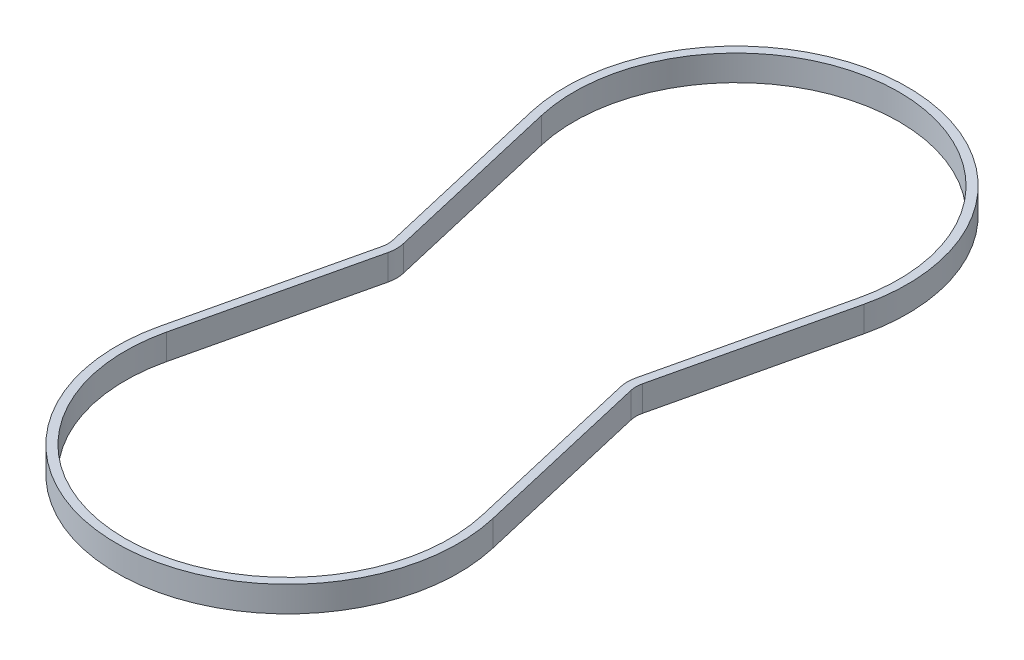
ISO-10303-21;
HEADER;
FILE_DESCRIPTION(('STEP AP214'),'2;1');
FILE_NAME('part.step','',(''),(''),'','','');
FILE_SCHEMA(('AUTOMOTIVE_DESIGN { 1 0 10303 214 1 1 1 1 }'));
ENDSEC;
DATA;
#1=APPLICATION_CONTEXT('core data for automotive mechanical design processes');
#2=APPLICATION_PROTOCOL_DEFINITION('international standard','automotive_design',2000,#1);
#3=PRODUCT_CONTEXT('',#1,'mechanical');
#4=PRODUCT('Part','Part','',(#3));
#5=PRODUCT_RELATED_PRODUCT_CATEGORY('part','',(#4));
#6=PRODUCT_DEFINITION_FORMATION('','',#4);
#7=PRODUCT_DEFINITION_CONTEXT('part definition',#1,'design');
#8=PRODUCT_DEFINITION('design','',#6,#7);
#9=PRODUCT_DEFINITION_SHAPE('','',#8);
#10=(LENGTH_UNIT() NAMED_UNIT(*) SI_UNIT(.MILLI.,.METRE.));
#11=(NAMED_UNIT(*) PLANE_ANGLE_UNIT() SI_UNIT($,.RADIAN.));
#12=(NAMED_UNIT(*) SI_UNIT($,.STERADIAN.) SOLID_ANGLE_UNIT());
#13=UNCERTAINTY_MEASURE_WITH_UNIT(LENGTH_MEASURE(1.E-05),#10,'distance_accuracy_value','');
#14=(GEOMETRIC_REPRESENTATION_CONTEXT(3) GLOBAL_UNCERTAINTY_ASSIGNED_CONTEXT((#13)) GLOBAL_UNIT_ASSIGNED_CONTEXT((#10,
#11,#12)) REPRESENTATION_CONTEXT('',''));
#15=CARTESIAN_POINT('',(0.,0.,0.));
#16=DIRECTION('',(0.,0.,1.));
#17=DIRECTION('',(1.,0.,0.));
#18=AXIS2_PLACEMENT_3D('',#15,#16,#17);
#19=CARTESIAN_POINT('',(0.,6.,-52.5));
#20=DIRECTION('',(0.,1.,0.));
#21=DIRECTION('',(0.,0.,1.));
#22=AXIS2_PLACEMENT_3D('',#19,#20,#21);
#23=PLANE('',#22);
#24=CARTESIAN_POINT('',(0.,6.,-52.5));
#25=DIRECTION('',(0.,1.,0.));
#26=DIRECTION('',(0.,0.,1.));
#27=AXIS2_PLACEMENT_3D('',#24,#25,#26);
#28=CIRCLE('',#27,40.);
#29=CARTESIAN_POINT('',(38.9565926048337,6.,-43.4234426889368));
#30=VERTEX_POINT('',#29);
#31=CARTESIAN_POINT('',(-38.9565926048337,6.,-43.4234426889368));
#32=VERTEX_POINT('',#31);
#33=EDGE_CURVE('E261',#30,#32,#28,.T.);
#34=ORIENTED_EDGE('',*,*,#33,.T.);
#35=DIRECTION('',(0.226913932776581,0.,0.973914815120843));
#36=VECTOR('',#35,1.);
#37=CARTESIAN_POINT('',(-38.9565926048337,6.,-43.4234426889368));
#38=LINE('',#37,#36);
#39=CARTESIAN_POINT('',(-29.1565111092749,6.,-1.36148359665949));
#40=VERTEX_POINT('',#39);
#41=EDGE_CURVE('E264',#32,#40,#38,.T.);
#42=ORIENTED_EDGE('',*,*,#41,.T.);
#43=CARTESIAN_POINT('',(-35.,6.,0.));
#44=DIRECTION('',(0.,-1.,0.));
#45=DIRECTION('',(0.,0.,1.));
#46=AXIS2_PLACEMENT_3D('',#43,#44,#45);
#47=CIRCLE('',#46,6.);
#48=CARTESIAN_POINT('',(-29.1565111092749,6.,1.36148359665949));
#49=VERTEX_POINT('',#48);
#50=EDGE_CURVE('E267',#40,#49,#47,.T.);
#51=ORIENTED_EDGE('',*,*,#50,.T.);
#52=DIRECTION('',(-0.226913932776581,0.,0.973914815120843));
#53=VECTOR('',#52,1.);
#54=CARTESIAN_POINT('',(-38.9565926048337,6.,43.4234426889368));
#55=LINE('',#54,#53);
#56=CARTESIAN_POINT('',(-38.9565926048337,6.,43.4234426889368));
#57=VERTEX_POINT('',#56);
#58=EDGE_CURVE('E269',#49,#57,#55,.T.);
#59=ORIENTED_EDGE('',*,*,#58,.T.);
#60=CARTESIAN_POINT('',(0.,6.,52.5));
#61=DIRECTION('',(0.,1.,0.));
#62=DIRECTION('',(0.,0.,1.));
#63=AXIS2_PLACEMENT_3D('',#60,#61,#62);
#64=CIRCLE('',#63,40.);
#65=CARTESIAN_POINT('',(38.9565926048337,6.,43.4234426889368));
#66=VERTEX_POINT('',#65);
#67=EDGE_CURVE('E271',#57,#66,#64,.T.);
#68=ORIENTED_EDGE('',*,*,#67,.T.);
#69=DIRECTION('',(-0.226913932776581,0.,-0.973914815120843));
#70=VECTOR('',#69,1.);
#71=CARTESIAN_POINT('',(29.1565111092749,6.,1.36148359665949));
#72=LINE('',#71,#70);
#73=CARTESIAN_POINT('',(29.1565111092749,6.,1.36148359665949));
#74=VERTEX_POINT('',#73);
#75=EDGE_CURVE('E273',#66,#74,#72,.T.);
#76=ORIENTED_EDGE('',*,*,#75,.T.);
#77=CARTESIAN_POINT('',(35.,6.,0.));
#78=DIRECTION('',(0.,-1.,0.));
#79=DIRECTION('',(0.,0.,1.));
#80=AXIS2_PLACEMENT_3D('',#77,#78,#79);
#81=CIRCLE('',#80,6.);
#82=CARTESIAN_POINT('',(29.1565111092749,6.,-1.36148359665948));
#83=VERTEX_POINT('',#82);
#84=EDGE_CURVE('E275',#74,#83,#81,.T.);
#85=ORIENTED_EDGE('',*,*,#84,.T.);
#86=DIRECTION('',(0.226913932776581,0.,-0.973914815120843));
#87=VECTOR('',#86,1.);
#88=CARTESIAN_POINT('',(38.9565926048337,6.,-43.4234426889368));
#89=LINE('',#88,#87);
#90=EDGE_CURVE('E277',#83,#30,#89,.T.);
#91=ORIENTED_EDGE('',*,*,#90,.T.);
#92=EDGE_LOOP('',(#34,#42,#51,#59,#68,#76,#85,#91));
#93=FACE_BOUND('',#92,.T.);
#94=DIRECTION('',(0.226913932776581,0.,0.973914815120843));
#95=VECTOR('',#94,1.);
#96=CARTESIAN_POINT('',(-37.008762974592,6.,-43.8772705544899));
#97=LINE('',#96,#95);
#98=CARTESIAN_POINT('',(-37.008762974592,6.,-43.8772705544899));
#99=VERTEX_POINT('',#98);
#100=CARTESIAN_POINT('',(-27.2086814790333,6.,-1.81531146221264));
#101=VERTEX_POINT('',#100);
#102=EDGE_CURVE('E204',#99,#101,#97,.T.);
#103=ORIENTED_EDGE('',*,*,#102,.F.);
#104=CARTESIAN_POINT('',(0.,6.,-52.5));
#105=DIRECTION('',(0.,1.,0.));
#106=DIRECTION('',(1.,0.,0.));
#107=AXIS2_PLACEMENT_3D('',#104,#105,#106);
#108=CIRCLE('',#107,38.);
#109=CARTESIAN_POINT('',(37.008762974592,6.,-43.8772705544899));
#110=VERTEX_POINT('',#109);
#111=EDGE_CURVE('E196',#110,#99,#108,.T.);
#112=ORIENTED_EDGE('',*,*,#111,.F.);
#113=DIRECTION('',(0.226913932776581,0.,-0.973914815120843));
#114=VECTOR('',#113,1.);
#115=CARTESIAN_POINT('',(37.008762974592,6.,-43.8772705544899));
#116=LINE('',#115,#114);
#117=CARTESIAN_POINT('',(27.2086814790333,6.,-1.81531146221265));
#118=VERTEX_POINT('',#117);
#119=EDGE_CURVE('E229',#118,#110,#116,.T.);
#120=ORIENTED_EDGE('',*,*,#119,.F.);
#121=CARTESIAN_POINT('',(35.,6.,0.));
#122=DIRECTION('',(0.,1.,0.));
#123=DIRECTION('',(1.,0.,0.));
#124=AXIS2_PLACEMENT_3D('',#121,#122,#123);
#125=CIRCLE('',#124,8.);
#126=CARTESIAN_POINT('',(27.2086814790333,6.,1.81531146221265));
#127=VERTEX_POINT('',#126);
#128=EDGE_CURVE('E227',#127,#118,#125,.F.);
#129=ORIENTED_EDGE('',*,*,#128,.F.);
#130=DIRECTION('',(-0.226913932776581,0.,-0.973914815120843));
#131=VECTOR('',#130,1.);
#132=CARTESIAN_POINT('',(27.2086814790333,6.,1.81531146221265));
#133=LINE('',#132,#131);
#134=CARTESIAN_POINT('',(37.008762974592,6.,43.8772705544899));
#135=VERTEX_POINT('',#134);
#136=EDGE_CURVE('E225',#135,#127,#133,.T.);
#137=ORIENTED_EDGE('',*,*,#136,.F.);
#138=CARTESIAN_POINT('',(0.,6.,52.5));
#139=DIRECTION('',(0.,1.,0.));
#140=DIRECTION('',(1.,0.,0.));
#141=AXIS2_PLACEMENT_3D('',#138,#139,#140);
#142=CIRCLE('',#141,38.);
#143=CARTESIAN_POINT('',(-37.008762974592,6.,43.8772705544899));
#144=VERTEX_POINT('',#143);
#145=EDGE_CURVE('E223',#144,#135,#142,.T.);
#146=ORIENTED_EDGE('',*,*,#145,.F.);
#147=DIRECTION('',(-0.226913932776581,0.,0.973914815120843));
#148=VECTOR('',#147,1.);
#149=CARTESIAN_POINT('',(-37.008762974592,6.,43.8772705544899));
#150=LINE('',#149,#148);
#151=CARTESIAN_POINT('',(-27.2086814790333,6.,1.81531146221265));
#152=VERTEX_POINT('',#151);
#153=EDGE_CURVE('E219',#152,#144,#150,.T.);
#154=ORIENTED_EDGE('',*,*,#153,.F.);
#155=CARTESIAN_POINT('',(-35.,6.,0.));
#156=DIRECTION('',(0.,1.,0.));
#157=DIRECTION('',(1.,0.,0.));
#158=AXIS2_PLACEMENT_3D('',#155,#156,#157);
#159=CIRCLE('',#158,8.);
#160=EDGE_CURVE('E217',#101,#152,#159,.F.);
#161=ORIENTED_EDGE('',*,*,#160,.F.);
#162=EDGE_LOOP('',(#103,#112,#120,#129,#137,#146,#154,#161));
#163=FACE_BOUND('',#162,.T.);
#164=ADVANCED_FACE('F83',(#93,#163),#23,.T.);
#165=CARTESIAN_POINT('',(0.,0.,-52.5));
#166=DIRECTION('',(0.,1.,0.));
#167=DIRECTION('',(0.,0.,1.));
#168=AXIS2_PLACEMENT_3D('',#165,#166,#167);
#169=PLANE('',#168);
#170=CARTESIAN_POINT('',(0.,0.,-52.5));
#171=DIRECTION('',(0.,1.,0.));
#172=DIRECTION('',(0.,0.,1.));
#173=AXIS2_PLACEMENT_3D('',#170,#171,#172);
#174=CIRCLE('',#173,40.);
#175=CARTESIAN_POINT('',(38.9565926048337,0.,-43.4234426889368));
#176=VERTEX_POINT('',#175);
#177=CARTESIAN_POINT('',(-38.9565926048337,0.,-43.4234426889368));
#178=VERTEX_POINT('',#177);
#179=EDGE_CURVE('E212',#176,#178,#174,.T.);
#180=ORIENTED_EDGE('',*,*,#179,.F.);
#181=DIRECTION('',(0.226913932776581,0.,-0.973914815120843));
#182=VECTOR('',#181,1.);
#183=CARTESIAN_POINT('',(38.9565926048337,0.,-43.4234426889368));
#184=LINE('',#183,#182);
#185=CARTESIAN_POINT('',(29.1565111092749,0.,-1.36148359665948));
#186=VERTEX_POINT('',#185);
#187=EDGE_CURVE('E265',#186,#176,#184,.T.);
#188=ORIENTED_EDGE('',*,*,#187,.F.);
#189=CARTESIAN_POINT('',(35.,0.,0.));
#190=DIRECTION('',(0.,-1.,0.));
#191=DIRECTION('',(0.,0.,1.));
#192=AXIS2_PLACEMENT_3D('',#189,#190,#191);
#193=CIRCLE('',#192,6.);
#194=CARTESIAN_POINT('',(29.1565111092749,0.,1.36148359665949));
#195=VERTEX_POINT('',#194);
#196=EDGE_CURVE('E292',#195,#186,#193,.T.);
#197=ORIENTED_EDGE('',*,*,#196,.F.);
#198=DIRECTION('',(-0.226913932776581,0.,-0.973914815120843));
#199=VECTOR('',#198,1.);
#200=CARTESIAN_POINT('',(29.1565111092749,0.,1.36148359665949));
#201=LINE('',#200,#199);
#202=CARTESIAN_POINT('',(38.9565926048337,0.,43.4234426889368));
#203=VERTEX_POINT('',#202);
#204=EDGE_CURVE('E290',#203,#195,#201,.T.);
#205=ORIENTED_EDGE('',*,*,#204,.F.);
#206=CARTESIAN_POINT('',(0.,0.,52.5));
#207=DIRECTION('',(0.,1.,0.));
#208=DIRECTION('',(0.,0.,1.));
#209=AXIS2_PLACEMENT_3D('',#206,#207,#208);
#210=CIRCLE('',#209,40.);
#211=CARTESIAN_POINT('',(-38.9565926048337,0.,43.4234426889368));
#212=VERTEX_POINT('',#211);
#213=EDGE_CURVE('E288',#212,#203,#210,.T.);
#214=ORIENTED_EDGE('',*,*,#213,.F.);
#215=DIRECTION('',(-0.226913932776581,0.,0.973914815120843));
#216=VECTOR('',#215,1.);
#217=CARTESIAN_POINT('',(-38.9565926048337,0.,43.4234426889368));
#218=LINE('',#217,#216);
#219=CARTESIAN_POINT('',(-29.1565111092749,0.,1.36148359665949));
#220=VERTEX_POINT('',#219);
#221=EDGE_CURVE('E286',#220,#212,#218,.T.);
#222=ORIENTED_EDGE('',*,*,#221,.F.);
#223=CARTESIAN_POINT('',(-35.,0.,0.));
#224=DIRECTION('',(0.,-1.,0.));
#225=DIRECTION('',(0.,0.,1.));
#226=AXIS2_PLACEMENT_3D('',#223,#224,#225);
#227=CIRCLE('',#226,6.);
#228=CARTESIAN_POINT('',(-29.1565111092749,0.,-1.36148359665949));
#229=VERTEX_POINT('',#228);
#230=EDGE_CURVE('E284',#229,#220,#227,.T.);
#231=ORIENTED_EDGE('',*,*,#230,.F.);
#232=DIRECTION('',(0.226913932776581,0.,0.973914815120843));
#233=VECTOR('',#232,1.);
#234=CARTESIAN_POINT('',(-38.9565926048337,0.,-43.4234426889368));
#235=LINE('',#234,#233);
#236=EDGE_CURVE('E282',#178,#229,#235,.T.);
#237=ORIENTED_EDGE('',*,*,#236,.F.);
#238=EDGE_LOOP('',(#180,#188,#197,#205,#214,#222,#231,#237));
#239=FACE_BOUND('',#238,.T.);
#240=CARTESIAN_POINT('',(0.,0.,-52.5));
#241=DIRECTION('',(0.,1.,0.));
#242=DIRECTION('',(1.,0.,0.));
#243=AXIS2_PLACEMENT_3D('',#240,#241,#242);
#244=CIRCLE('',#243,38.);
#245=CARTESIAN_POINT('',(37.008762974592,0.,-43.8772705544899));
#246=VERTEX_POINT('',#245);
#247=CARTESIAN_POINT('',(-37.008762974592,0.,-43.8772705544899));
#248=VERTEX_POINT('',#247);
#249=EDGE_CURVE('E106',#246,#248,#244,.T.);
#250=ORIENTED_EDGE('',*,*,#249,.T.);
#251=DIRECTION('',(0.226913932776581,0.,0.973914815120843));
#252=VECTOR('',#251,1.);
#253=CARTESIAN_POINT('',(-37.008762974592,0.,-43.8772705544899));
#254=LINE('',#253,#252);
#255=CARTESIAN_POINT('',(-27.2086814790333,0.,-1.81531146221264));
#256=VERTEX_POINT('',#255);
#257=EDGE_CURVE('E211',#248,#256,#254,.T.);
#258=ORIENTED_EDGE('',*,*,#257,.T.);
#259=CARTESIAN_POINT('',(-35.,0.,0.));
#260=DIRECTION('',(0.,1.,0.));
#261=DIRECTION('',(1.,0.,0.));
#262=AXIS2_PLACEMENT_3D('',#259,#260,#261);
#263=CIRCLE('',#262,8.);
#264=CARTESIAN_POINT('',(-27.2086814790333,0.,1.81531146221265));
#265=VERTEX_POINT('',#264);
#266=EDGE_CURVE('E233',#256,#265,#263,.F.);
#267=ORIENTED_EDGE('',*,*,#266,.T.);
#268=DIRECTION('',(-0.226913932776581,0.,0.973914815120843));
#269=VECTOR('',#268,1.);
#270=CARTESIAN_POINT('',(-37.008762974592,0.,43.8772705544899));
#271=LINE('',#270,#269);
#272=CARTESIAN_POINT('',(-37.008762974592,0.,43.8772705544899));
#273=VERTEX_POINT('',#272);
#274=EDGE_CURVE('E236',#265,#273,#271,.T.);
#275=ORIENTED_EDGE('',*,*,#274,.T.);
#276=CARTESIAN_POINT('',(0.,0.,52.5));
#277=DIRECTION('',(0.,1.,0.));
#278=DIRECTION('',(1.,0.,0.));
#279=AXIS2_PLACEMENT_3D('',#276,#277,#278);
#280=CIRCLE('',#279,38.);
#281=CARTESIAN_POINT('',(37.008762974592,0.,43.8772705544899));
#282=VERTEX_POINT('',#281);
#283=EDGE_CURVE('E239',#273,#282,#280,.T.);
#284=ORIENTED_EDGE('',*,*,#283,.T.);
#285=DIRECTION('',(-0.226913932776581,0.,-0.973914815120843));
#286=VECTOR('',#285,1.);
#287=CARTESIAN_POINT('',(27.2086814790333,0.,1.81531146221265));
#288=LINE('',#287,#286);
#289=CARTESIAN_POINT('',(27.2086814790333,0.,1.81531146221265));
#290=VERTEX_POINT('',#289);
#291=EDGE_CURVE('E242',#282,#290,#288,.T.);
#292=ORIENTED_EDGE('',*,*,#291,.T.);
#293=CARTESIAN_POINT('',(35.,0.,0.));
#294=DIRECTION('',(0.,1.,0.));
#295=DIRECTION('',(1.,0.,0.));
#296=AXIS2_PLACEMENT_3D('',#293,#294,#295);
#297=CIRCLE('',#296,8.);
#298=CARTESIAN_POINT('',(27.2086814790333,0.,-1.81531146221265));
#299=VERTEX_POINT('',#298);
#300=EDGE_CURVE('E245',#290,#299,#297,.F.);
#301=ORIENTED_EDGE('',*,*,#300,.T.);
#302=DIRECTION('',(0.226913932776581,0.,-0.973914815120843));
#303=VECTOR('',#302,1.);
#304=CARTESIAN_POINT('',(37.008762974592,0.,-43.8772705544899));
#305=LINE('',#304,#303);
#306=EDGE_CURVE('E205',#299,#246,#305,.T.);
#307=ORIENTED_EDGE('',*,*,#306,.T.);
#308=EDGE_LOOP('',(#250,#258,#267,#275,#284,#292,#301,#307));
#309=FACE_BOUND('',#308,.T.);
#310=ADVANCED_FACE('F322',(#239,#309),#169,.F.);
#311=CARTESIAN_POINT('',(0.,6.,-52.5));
#312=DIRECTION('',(0.,-1.,0.));
#313=DIRECTION('',(0.,0.,-1.));
#314=AXIS2_PLACEMENT_3D('',#311,#312,#313);
#315=CYLINDRICAL_SURFACE('',#314,40.);
#316=ORIENTED_EDGE('',*,*,#179,.T.);
#317=DIRECTION('',(0.,-1.,0.));
#318=VECTOR('',#317,1.);
#319=CARTESIAN_POINT('',(-38.9565926048337,6.,-43.4234426889368));
#320=LINE('',#319,#318);
#321=EDGE_CURVE('E12',#32,#178,#320,.T.);
#322=ORIENTED_EDGE('',*,*,#321,.F.);
#323=ORIENTED_EDGE('',*,*,#33,.F.);
#324=DIRECTION('',(0.,-1.,0.));
#325=VECTOR('',#324,1.);
#326=CARTESIAN_POINT('',(38.9565926048337,6.,-43.4234426889368));
#327=LINE('',#326,#325);
#328=EDGE_CURVE('E279',#30,#176,#327,.T.);
#329=ORIENTED_EDGE('',*,*,#328,.T.);
#330=EDGE_LOOP('',(#316,#322,#323,#329));
#331=FACE_BOUND('',#330,.T.);
#332=ADVANCED_FACE('F85',(#331),#315,.T.);
#333=CARTESIAN_POINT('',(-38.9565926048337,6.,-43.4234426889368));
#334=DIRECTION('',(0.973914815120843,0.,-0.226913932776581));
#335=DIRECTION('',(-0.226913932776581,0.,-0.973914815120843));
#336=AXIS2_PLACEMENT_3D('',#333,#334,#335);
#337=PLANE('',#336);
#338=ORIENTED_EDGE('',*,*,#236,.T.);
#339=DIRECTION('',(0.,-1.,0.));
#340=VECTOR('',#339,1.);
#341=CARTESIAN_POINT('',(-29.1565111092749,6.,-1.36148359665949));
#342=LINE('',#341,#340);
#343=EDGE_CURVE('E91',#40,#229,#342,.T.);
#344=ORIENTED_EDGE('',*,*,#343,.F.);
#345=ORIENTED_EDGE('',*,*,#41,.F.);
#346=ORIENTED_EDGE('',*,*,#321,.T.);
#347=EDGE_LOOP('',(#338,#344,#345,#346));
#348=FACE_BOUND('',#347,.T.);
#349=ADVANCED_FACE('F339',(#348),#337,.F.);
#350=CARTESIAN_POINT('',(-35.,6.,0.));
#351=DIRECTION('',(0.,-1.,0.));
#352=DIRECTION('',(0.,0.,-1.));
#353=AXIS2_PLACEMENT_3D('',#350,#351,#352);
#354=CYLINDRICAL_SURFACE('',#353,6.);
#355=ORIENTED_EDGE('',*,*,#230,.T.);
#356=DIRECTION('',(0.,-1.,0.));
#357=VECTOR('',#356,1.);
#358=CARTESIAN_POINT('',(-29.1565111092749,6.,1.36148359665949));
#359=LINE('',#358,#357);
#360=EDGE_CURVE('E309',#49,#220,#359,.T.);
#361=ORIENTED_EDGE('',*,*,#360,.F.);
#362=ORIENTED_EDGE('',*,*,#50,.F.);
#363=ORIENTED_EDGE('',*,*,#343,.T.);
#364=EDGE_LOOP('',(#355,#361,#362,#363));
#365=FACE_BOUND('',#364,.T.);
#366=ADVANCED_FACE('F316',(#365),#354,.F.);
#367=CARTESIAN_POINT('',(-38.9565926048337,6.,43.4234426889368));
#368=DIRECTION('',(0.973914815120843,0.,0.226913932776581));
#369=DIRECTION('',(0.226913932776581,0.,-0.973914815120843));
#370=AXIS2_PLACEMENT_3D('',#367,#368,#369);
#371=PLANE('',#370);
#372=ORIENTED_EDGE('',*,*,#221,.T.);
#373=DIRECTION('',(0.,-1.,0.));
#374=VECTOR('',#373,1.);
#375=CARTESIAN_POINT('',(-38.9565926048337,6.,43.4234426889368));
#376=LINE('',#375,#374);
#377=EDGE_CURVE('E306',#57,#212,#376,.T.);
#378=ORIENTED_EDGE('',*,*,#377,.F.);
#379=ORIENTED_EDGE('',*,*,#58,.F.);
#380=ORIENTED_EDGE('',*,*,#360,.T.);
#381=EDGE_LOOP('',(#372,#378,#379,#380));
#382=FACE_BOUND('',#381,.T.);
#383=ADVANCED_FACE('F328',(#382),#371,.F.);
#384=CARTESIAN_POINT('',(0.,6.,52.5));
#385=DIRECTION('',(0.,-1.,0.));
#386=DIRECTION('',(0.,0.,-1.));
#387=AXIS2_PLACEMENT_3D('',#384,#385,#386);
#388=CYLINDRICAL_SURFACE('',#387,40.);
#389=ORIENTED_EDGE('',*,*,#213,.T.);
#390=DIRECTION('',(0.,-1.,0.));
#391=VECTOR('',#390,1.);
#392=CARTESIAN_POINT('',(38.9565926048337,6.,43.4234426889368));
#393=LINE('',#392,#391);
#394=EDGE_CURVE('E303',#66,#203,#393,.T.);
#395=ORIENTED_EDGE('',*,*,#394,.F.);
#396=ORIENTED_EDGE('',*,*,#67,.F.);
#397=ORIENTED_EDGE('',*,*,#377,.T.);
#398=EDGE_LOOP('',(#389,#395,#396,#397));
#399=FACE_BOUND('',#398,.T.);
#400=ADVANCED_FACE('F332',(#399),#388,.T.);
#401=CARTESIAN_POINT('',(29.1565111092749,6.,1.36148359665949));
#402=DIRECTION('',(-0.973914815120843,0.,0.226913932776581));
#403=DIRECTION('',(0.226913932776581,0.,0.973914815120843));
#404=AXIS2_PLACEMENT_3D('',#401,#402,#403);
#405=PLANE('',#404);
#406=ORIENTED_EDGE('',*,*,#204,.T.);
#407=DIRECTION('',(0.,-1.,0.));
#408=VECTOR('',#407,1.);
#409=CARTESIAN_POINT('',(29.1565111092749,6.,1.36148359665949));
#410=LINE('',#409,#408);
#411=EDGE_CURVE('E300',#74,#195,#410,.T.);
#412=ORIENTED_EDGE('',*,*,#411,.F.);
#413=ORIENTED_EDGE('',*,*,#75,.F.);
#414=ORIENTED_EDGE('',*,*,#394,.T.);
#415=EDGE_LOOP('',(#406,#412,#413,#414));
#416=FACE_BOUND('',#415,.T.);
#417=ADVANCED_FACE('F352',(#416),#405,.F.);
#418=CARTESIAN_POINT('',(35.,6.,0.));
#419=DIRECTION('',(0.,-1.,0.));
#420=DIRECTION('',(0.,0.,-1.));
#421=AXIS2_PLACEMENT_3D('',#418,#419,#420);
#422=CYLINDRICAL_SURFACE('',#421,6.);
#423=ORIENTED_EDGE('',*,*,#196,.T.);
#424=DIRECTION('',(0.,-1.,0.));
#425=VECTOR('',#424,1.);
#426=CARTESIAN_POINT('',(29.1565111092749,6.,-1.36148359665948));
#427=LINE('',#426,#425);
#428=EDGE_CURVE('E297',#83,#186,#427,.T.);
#429=ORIENTED_EDGE('',*,*,#428,.F.);
#430=ORIENTED_EDGE('',*,*,#84,.F.);
#431=ORIENTED_EDGE('',*,*,#411,.T.);
#432=EDGE_LOOP('',(#423,#429,#430,#431));
#433=FACE_BOUND('',#432,.T.);
#434=ADVANCED_FACE('F350',(#433),#422,.F.);
#435=CARTESIAN_POINT('',(38.9565926048337,6.,-43.4234426889368));
#436=DIRECTION('',(-0.973914815120843,0.,-0.226913932776581));
#437=DIRECTION('',(-0.226913932776581,0.,0.973914815120843));
#438=AXIS2_PLACEMENT_3D('',#435,#436,#437);
#439=PLANE('',#438);
#440=ORIENTED_EDGE('',*,*,#187,.T.);
#441=ORIENTED_EDGE('',*,*,#328,.F.);
#442=ORIENTED_EDGE('',*,*,#90,.F.);
#443=ORIENTED_EDGE('',*,*,#428,.T.);
#444=EDGE_LOOP('',(#440,#441,#442,#443));
#445=FACE_BOUND('',#444,.T.);
#446=ADVANCED_FACE('F345',(#445),#439,.F.);
#447=CARTESIAN_POINT('',(0.,6.,-52.5));
#448=DIRECTION('',(0.,-1.,0.));
#449=DIRECTION('',(0.,0.,-1.));
#450=AXIS2_PLACEMENT_3D('',#447,#448,#449);
#451=CYLINDRICAL_SURFACE('',#450,38.);
#452=ORIENTED_EDGE('',*,*,#249,.F.);
#453=DIRECTION('',(0.,-1.,0.));
#454=VECTOR('',#453,1.);
#455=CARTESIAN_POINT('',(37.008762974592,6.,-43.8772705544899));
#456=LINE('',#455,#454);
#457=EDGE_CURVE('E200',#110,#246,#456,.T.);
#458=ORIENTED_EDGE('',*,*,#457,.F.);
#459=ORIENTED_EDGE('',*,*,#111,.T.);
#460=DIRECTION('',(0.,-1.,0.));
#461=VECTOR('',#460,1.);
#462=CARTESIAN_POINT('',(-37.008762974592,6.,-43.8772705544899));
#463=LINE('',#462,#461);
#464=EDGE_CURVE('E199',#99,#248,#463,.T.);
#465=ORIENTED_EDGE('',*,*,#464,.T.);
#466=EDGE_LOOP('',(#452,#458,#459,#465));
#467=FACE_BOUND('',#466,.T.);
#468=ADVANCED_FACE('F198',(#467),#451,.F.);
#469=CARTESIAN_POINT('',(-37.008762974592,6.,-43.8772705544899));
#470=DIRECTION('',(0.973914815120843,0.,-0.226913932776581));
#471=DIRECTION('',(-0.226913932776581,0.,-0.973914815120843));
#472=AXIS2_PLACEMENT_3D('',#469,#470,#471);
#473=PLANE('',#472);
#474=ORIENTED_EDGE('',*,*,#257,.F.);
#475=ORIENTED_EDGE('',*,*,#464,.F.);
#476=ORIENTED_EDGE('',*,*,#102,.T.);
#477=DIRECTION('',(0.,-1.,0.));
#478=VECTOR('',#477,1.);
#479=CARTESIAN_POINT('',(-27.2086814790333,6.,-1.81531146221264));
#480=LINE('',#479,#478);
#481=EDGE_CURVE('E213',#101,#256,#480,.T.);
#482=ORIENTED_EDGE('',*,*,#481,.T.);
#483=EDGE_LOOP('',(#474,#475,#476,#482));
#484=FACE_BOUND('',#483,.T.);
#485=ADVANCED_FACE('F208',(#484),#473,.T.);
#486=CARTESIAN_POINT('',(-35.,6.,0.));
#487=DIRECTION('',(0.,-1.,0.));
#488=DIRECTION('',(0.,0.,-1.));
#489=AXIS2_PLACEMENT_3D('',#486,#487,#488);
#490=CYLINDRICAL_SURFACE('',#489,8.);
#491=ORIENTED_EDGE('',*,*,#266,.F.);
#492=ORIENTED_EDGE('',*,*,#481,.F.);
#493=ORIENTED_EDGE('',*,*,#160,.T.);
#494=DIRECTION('',(0.,-1.,0.));
#495=VECTOR('',#494,1.);
#496=CARTESIAN_POINT('',(-27.2086814790333,6.,1.81531146221265));
#497=LINE('',#496,#495);
#498=EDGE_CURVE('E258',#152,#265,#497,.T.);
#499=ORIENTED_EDGE('',*,*,#498,.T.);
#500=EDGE_LOOP('',(#491,#492,#493,#499));
#501=FACE_BOUND('',#500,.T.);
#502=ADVANCED_FACE('F377',(#501),#490,.T.);
#503=CARTESIAN_POINT('',(-37.008762974592,6.,43.8772705544899));
#504=DIRECTION('',(0.973914815120843,0.,0.226913932776581));
#505=DIRECTION('',(0.226913932776581,0.,-0.973914815120843));
#506=AXIS2_PLACEMENT_3D('',#503,#504,#505);
#507=PLANE('',#506);
#508=ORIENTED_EDGE('',*,*,#274,.F.);
#509=ORIENTED_EDGE('',*,*,#498,.F.);
#510=ORIENTED_EDGE('',*,*,#153,.T.);
#511=DIRECTION('',(0.,-1.,0.));
#512=VECTOR('',#511,1.);
#513=CARTESIAN_POINT('',(-37.008762974592,6.,43.8772705544899));
#514=LINE('',#513,#512);
#515=EDGE_CURVE('E256',#144,#273,#514,.T.);
#516=ORIENTED_EDGE('',*,*,#515,.T.);
#517=EDGE_LOOP('',(#508,#509,#510,#516));
#518=FACE_BOUND('',#517,.T.);
#519=ADVANCED_FACE('F381',(#518),#507,.T.);
#520=CARTESIAN_POINT('',(0.,6.,52.5));
#521=DIRECTION('',(0.,-1.,0.));
#522=DIRECTION('',(0.,0.,-1.));
#523=AXIS2_PLACEMENT_3D('',#520,#521,#522);
#524=CYLINDRICAL_SURFACE('',#523,38.);
#525=ORIENTED_EDGE('',*,*,#283,.F.);
#526=ORIENTED_EDGE('',*,*,#515,.F.);
#527=ORIENTED_EDGE('',*,*,#145,.T.);
#528=DIRECTION('',(0.,-1.,0.));
#529=VECTOR('',#528,1.);
#530=CARTESIAN_POINT('',(37.008762974592,6.,43.8772705544899));
#531=LINE('',#530,#529);
#532=EDGE_CURVE('E254',#135,#282,#531,.T.);
#533=ORIENTED_EDGE('',*,*,#532,.T.);
#534=EDGE_LOOP('',(#525,#526,#527,#533));
#535=FACE_BOUND('',#534,.T.);
#536=ADVANCED_FACE('F387',(#535),#524,.F.);
#537=CARTESIAN_POINT('',(27.2086814790333,6.,1.81531146221265));
#538=DIRECTION('',(-0.973914815120843,0.,0.226913932776581));
#539=DIRECTION('',(0.226913932776581,0.,0.973914815120843));
#540=AXIS2_PLACEMENT_3D('',#537,#538,#539);
#541=PLANE('',#540);
#542=ORIENTED_EDGE('',*,*,#291,.F.);
#543=ORIENTED_EDGE('',*,*,#532,.F.);
#544=ORIENTED_EDGE('',*,*,#136,.T.);
#545=DIRECTION('',(0.,-1.,0.));
#546=VECTOR('',#545,1.);
#547=CARTESIAN_POINT('',(27.2086814790333,6.,1.81531146221265));
#548=LINE('',#547,#546);
#549=EDGE_CURVE('E252',#127,#290,#548,.T.);
#550=ORIENTED_EDGE('',*,*,#549,.T.);
#551=EDGE_LOOP('',(#542,#543,#544,#550));
#552=FACE_BOUND('',#551,.T.);
#553=ADVANCED_FACE('F391',(#552),#541,.T.);
#554=CARTESIAN_POINT('',(35.,6.,0.));
#555=DIRECTION('',(0.,-1.,0.));
#556=DIRECTION('',(0.,0.,-1.));
#557=AXIS2_PLACEMENT_3D('',#554,#555,#556);
#558=CYLINDRICAL_SURFACE('',#557,8.);
#559=ORIENTED_EDGE('',*,*,#300,.F.);
#560=ORIENTED_EDGE('',*,*,#549,.F.);
#561=ORIENTED_EDGE('',*,*,#128,.T.);
#562=DIRECTION('',(0.,-1.,0.));
#563=VECTOR('',#562,1.);
#564=CARTESIAN_POINT('',(27.2086814790333,6.,-1.81531146221265));
#565=LINE('',#564,#563);
#566=EDGE_CURVE('E98',#118,#299,#565,.T.);
#567=ORIENTED_EDGE('',*,*,#566,.T.);
#568=EDGE_LOOP('',(#559,#560,#561,#567));
#569=FACE_BOUND('',#568,.T.);
#570=ADVANCED_FACE('F395',(#569),#558,.T.);
#571=CARTESIAN_POINT('',(37.008762974592,6.,-43.8772705544899));
#572=DIRECTION('',(-0.973914815120843,0.,-0.226913932776581));
#573=DIRECTION('',(-0.226913932776581,0.,0.973914815120843));
#574=AXIS2_PLACEMENT_3D('',#571,#572,#573);
#575=PLANE('',#574);
#576=ORIENTED_EDGE('',*,*,#306,.F.);
#577=ORIENTED_EDGE('',*,*,#566,.F.);
#578=ORIENTED_EDGE('',*,*,#119,.T.);
#579=ORIENTED_EDGE('',*,*,#457,.T.);
#580=EDGE_LOOP('',(#576,#577,#578,#579));
#581=FACE_BOUND('',#580,.T.);
#582=ADVANCED_FACE('F399',(#581),#575,.T.);
#583=CLOSED_SHELL('',(#164,#310,#332,#349,#366,#383,#400,#417,#434,#446,#468,#485,#502,#519,
#536,#553,#570,#582));
#584=MANIFOLD_SOLID_BREP('B2',#583);
#585=ADVANCED_BREP_SHAPE_REPRESENTATION('',(#18,#584),#14);
#586=SHAPE_DEFINITION_REPRESENTATION(#9,#585);
ENDSEC;
END-ISO-10303-21;
